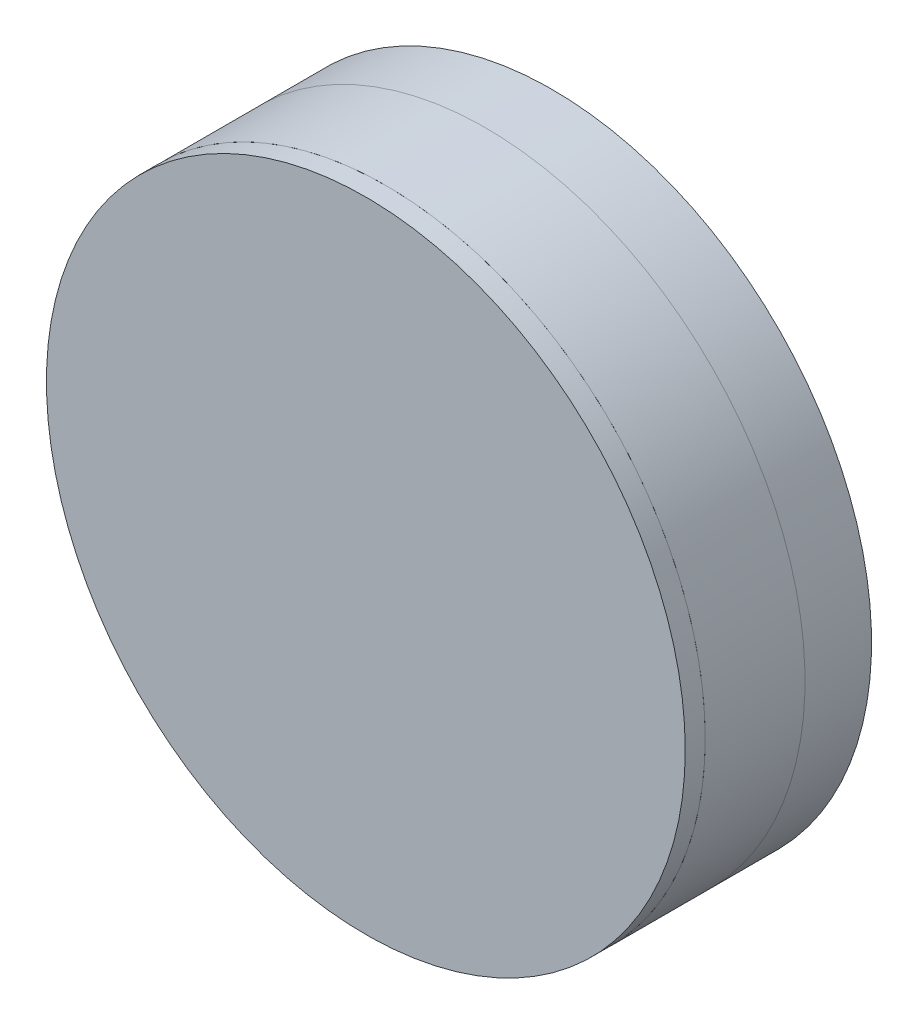
ISO-10303-21;
HEADER;
FILE_DESCRIPTION(('STEP AP214'),'2;1');
FILE_NAME('part.step','',(''),(''),'','','');
FILE_SCHEMA(('AUTOMOTIVE_DESIGN { 1 0 10303 214 1 1 1 1 }'));
ENDSEC;
DATA;
#1=APPLICATION_CONTEXT('core data for automotive mechanical design processes');
#2=APPLICATION_PROTOCOL_DEFINITION('international standard','automotive_design',2000,#1);
#3=PRODUCT_CONTEXT('',#1,'mechanical');
#4=PRODUCT('Part','Part','',(#3));
#5=PRODUCT_RELATED_PRODUCT_CATEGORY('part','',(#4));
#6=PRODUCT_DEFINITION_FORMATION('','',#4);
#7=PRODUCT_DEFINITION_CONTEXT('part definition',#1,'design');
#8=PRODUCT_DEFINITION('design','',#6,#7);
#9=PRODUCT_DEFINITION_SHAPE('','',#8);
#10=(LENGTH_UNIT() NAMED_UNIT(*) SI_UNIT(.MILLI.,.METRE.));
#11=(NAMED_UNIT(*) PLANE_ANGLE_UNIT() SI_UNIT($,.RADIAN.));
#12=(NAMED_UNIT(*) SI_UNIT($,.STERADIAN.) SOLID_ANGLE_UNIT());
#13=UNCERTAINTY_MEASURE_WITH_UNIT(LENGTH_MEASURE(1.E-05),#10,'distance_accuracy_value','');
#14=(GEOMETRIC_REPRESENTATION_CONTEXT(3) GLOBAL_UNCERTAINTY_ASSIGNED_CONTEXT((#13)) GLOBAL_UNIT_ASSIGNED_CONTEXT((#10,
#11,#12)) REPRESENTATION_CONTEXT('',''));
#15=CARTESIAN_POINT('',(0.,0.,0.));
#16=DIRECTION('',(0.,0.,1.));
#17=DIRECTION('',(1.,0.,0.));
#18=AXIS2_PLACEMENT_3D('',#15,#16,#17);
#19=CARTESIAN_POINT('',(0.,0.,-25.));
#20=DIRECTION('',(0.,0.,1.));
#21=DIRECTION('',(1.,0.,0.));
#22=AXIS2_PLACEMENT_3D('',#19,#20,#21);
#23=CYLINDRICAL_SURFACE('',#22,48.);
#24=CARTESIAN_POINT('',(0.,0.,-25.));
#25=DIRECTION('',(0.,0.,-1.));
#26=DIRECTION('',(-1.,0.,0.));
#27=AXIS2_PLACEMENT_3D('',#24,#25,#26);
#28=CIRCLE('',#27,48.);
#29=CARTESIAN_POINT('',(-48.,0.,-25.));
#30=VERTEX_POINT('',#29);
#31=EDGE_CURVE('E11',#30,#30,#28,.T.);
#32=ORIENTED_EDGE('',*,*,#31,.F.);
#33=EDGE_LOOP('',(#32));
#34=FACE_BOUND('',#33,.T.);
#35=CARTESIAN_POINT('',(0.,0.,-15.));
#36=DIRECTION('',(0.,0.,-1.));
#37=DIRECTION('',(-1.,0.,0.));
#38=AXIS2_PLACEMENT_3D('',#35,#36,#37);
#39=CIRCLE('',#38,48.);
#40=CARTESIAN_POINT('',(-48.,0.,-15.));
#41=VERTEX_POINT('',#40);
#42=EDGE_CURVE('E56',#41,#41,#39,.T.);
#43=ORIENTED_EDGE('',*,*,#42,.T.);
#44=EDGE_LOOP('',(#43));
#45=FACE_BOUND('',#44,.T.);
#46=ADVANCED_FACE('F53',(#34,#45),#23,.T.);
#47=CARTESIAN_POINT('',(0.,0.,-25.));
#48=DIRECTION('',(0.,0.,-1.));
#49=DIRECTION('',(-1.,0.,0.));
#50=AXIS2_PLACEMENT_3D('',#47,#48,#49);
#51=PLANE('',#50);
#52=ORIENTED_EDGE('',*,*,#31,.T.);
#53=EDGE_LOOP('',(#52));
#54=FACE_BOUND('',#53,.T.);
#55=ADVANCED_FACE('F68',(#54),#51,.T.);
#56=CARTESIAN_POINT('',(0.,0.,-15.));
#57=DIRECTION('',(0.,0.,-1.));
#58=DIRECTION('',(-1.,0.,0.));
#59=AXIS2_PLACEMENT_3D('',#56,#57,#58);
#60=PLANE('',#59);
#61=ORIENTED_EDGE('',*,*,#42,.F.);
#62=EDGE_LOOP('',(#61));
#63=FACE_BOUND('',#62,.T.);
#64=ADVANCED_FACE('F66',(#63),#60,.F.);
#65=CLOSED_SHELL('',(#46,#55,#64));
#66=MANIFOLD_SOLID_BREP('B2',#65);
#67=CARTESIAN_POINT('',(0.,0.,-15.));
#68=DIRECTION('',(0.,0.,1.));
#69=DIRECTION('',(1.,0.,0.));
#70=AXIS2_PLACEMENT_3D('',#67,#68,#69);
#71=CYLINDRICAL_SURFACE('',#70,48.);
#72=CARTESIAN_POINT('',(0.,0.,-15.));
#73=DIRECTION('',(0.,0.,-1.));
#74=DIRECTION('',(-1.,0.,0.));
#75=AXIS2_PLACEMENT_3D('',#72,#73,#74);
#76=CIRCLE('',#75,48.);
#77=CARTESIAN_POINT('',(-48.,0.,-15.));
#78=VERTEX_POINT('',#77);
#79=EDGE_CURVE('E52',#78,#78,#76,.T.);
#80=ORIENTED_EDGE('',*,*,#79,.F.);
#81=EDGE_LOOP('',(#80));
#82=FACE_BOUND('',#81,.T.);
#83=CARTESIAN_POINT('',(0.,0.,0.));
#84=DIRECTION('',(0.,0.,-1.));
#85=DIRECTION('',(-1.,0.,0.));
#86=AXIS2_PLACEMENT_3D('',#83,#84,#85);
#87=CIRCLE('',#86,48.);
#88=CARTESIAN_POINT('',(-48.,0.,0.));
#89=VERTEX_POINT('',#88);
#90=EDGE_CURVE('E103',#89,#89,#87,.T.);
#91=ORIENTED_EDGE('',*,*,#90,.T.);
#92=EDGE_LOOP('',(#91));
#93=FACE_BOUND('',#92,.T.);
#94=ADVANCED_FACE('F100',(#82,#93),#71,.T.);
#95=CARTESIAN_POINT('',(0.,0.,-15.));
#96=DIRECTION('',(0.,0.,-1.));
#97=DIRECTION('',(-1.,0.,0.));
#98=AXIS2_PLACEMENT_3D('',#95,#96,#97);
#99=PLANE('',#98);
#100=ORIENTED_EDGE('',*,*,#79,.T.);
#101=EDGE_LOOP('',(#100));
#102=FACE_BOUND('',#101,.T.);
#103=ADVANCED_FACE('F117',(#102),#99,.T.);
#104=CARTESIAN_POINT('',(0.,0.,0.));
#105=DIRECTION('',(0.,0.,-1.));
#106=DIRECTION('',(-1.,0.,0.));
#107=AXIS2_PLACEMENT_3D('',#104,#105,#106);
#108=PLANE('',#107);
#109=ORIENTED_EDGE('',*,*,#90,.F.);
#110=EDGE_LOOP('',(#109));
#111=FACE_BOUND('',#110,.T.);
#112=ADVANCED_FACE('F115',(#111),#108,.F.);
#113=CLOSED_SHELL('',(#94,#103,#112));
#114=MANIFOLD_SOLID_BREP('B6',#113);
#115=CARTESIAN_POINT('',(0.,0.,3.));
#116=DIRECTION('',(0.,0.,-1.));
#117=DIRECTION('',(-1.,0.,0.));
#118=AXIS2_PLACEMENT_3D('',#115,#116,#117);
#119=CYLINDRICAL_SURFACE('',#118,48.);
#120=CARTESIAN_POINT('',(0.,0.,3.));
#121=DIRECTION('',(0.,0.,1.));
#122=DIRECTION('',(1.,0.,0.));
#123=AXIS2_PLACEMENT_3D('',#120,#121,#122);
#124=CIRCLE('',#123,48.);
#125=CARTESIAN_POINT('',(48.,0.,3.));
#126=VERTEX_POINT('',#125);
#127=EDGE_CURVE('E99',#126,#126,#124,.T.);
#128=ORIENTED_EDGE('',*,*,#127,.F.);
#129=EDGE_LOOP('',(#128));
#130=FACE_BOUND('',#129,.T.);
#131=CARTESIAN_POINT('',(0.,0.,0.));
#132=DIRECTION('',(0.,0.,1.));
#133=DIRECTION('',(1.,0.,0.));
#134=AXIS2_PLACEMENT_3D('',#131,#132,#133);
#135=CIRCLE('',#134,48.);
#136=CARTESIAN_POINT('',(48.,0.,0.));
#137=VERTEX_POINT('',#136);
#138=EDGE_CURVE('E145',#137,#137,#135,.T.);
#139=ORIENTED_EDGE('',*,*,#138,.T.);
#140=EDGE_LOOP('',(#139));
#141=FACE_BOUND('',#140,.T.);
#142=ADVANCED_FACE('F142',(#130,#141),#119,.T.);
#143=CARTESIAN_POINT('',(0.,0.,3.));
#144=DIRECTION('',(0.,0.,1.));
#145=DIRECTION('',(1.,0.,0.));
#146=AXIS2_PLACEMENT_3D('',#143,#144,#145);
#147=PLANE('',#146);
#148=ORIENTED_EDGE('',*,*,#127,.T.);
#149=EDGE_LOOP('',(#148));
#150=FACE_BOUND('',#149,.T.);
#151=ADVANCED_FACE('F157',(#150),#147,.T.);
#152=CARTESIAN_POINT('',(0.,0.,0.));
#153=DIRECTION('',(0.,0.,1.));
#154=DIRECTION('',(1.,0.,0.));
#155=AXIS2_PLACEMENT_3D('',#152,#153,#154);
#156=PLANE('',#155);
#157=ORIENTED_EDGE('',*,*,#138,.F.);
#158=EDGE_LOOP('',(#157));
#159=FACE_BOUND('',#158,.T.);
#160=ADVANCED_FACE('F155',(#159),#156,.F.);
#161=CLOSED_SHELL('',(#142,#151,#160));
#162=MANIFOLD_SOLID_BREP('B47',#161);
#163=ADVANCED_BREP_SHAPE_REPRESENTATION('',(#18,#66,#114,#162),#14);
#164=SHAPE_DEFINITION_REPRESENTATION(#9,#163);
ENDSEC;
END-ISO-10303-21;
